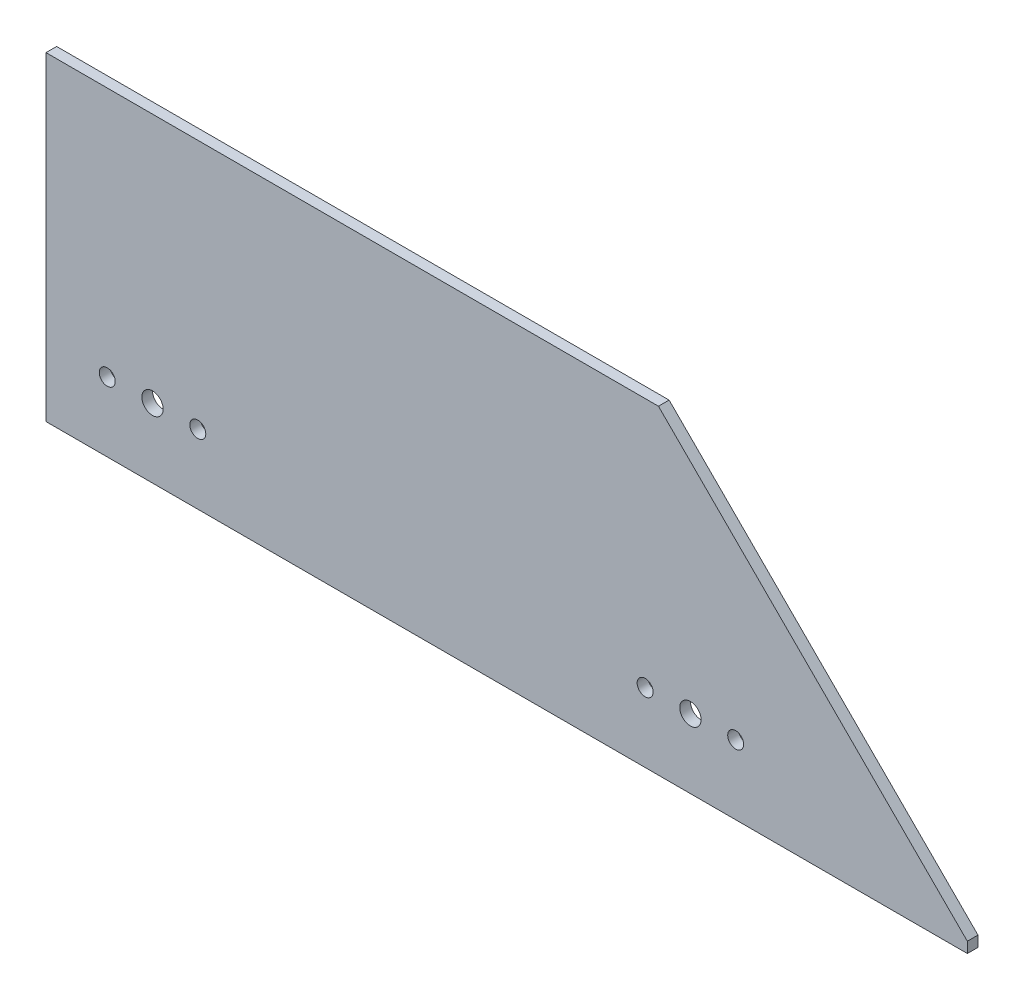
ISO-10303-21;
HEADER;
FILE_DESCRIPTION(('STEP AP214'),'2;1');
FILE_NAME('part.step','',(''),(''),'','','');
FILE_SCHEMA(('AUTOMOTIVE_DESIGN { 1 0 10303 214 1 1 1 1 }'));
ENDSEC;
DATA;
#1=APPLICATION_CONTEXT('core data for automotive mechanical design processes');
#2=APPLICATION_PROTOCOL_DEFINITION('international standard','automotive_design',2000,#1);
#3=PRODUCT_CONTEXT('',#1,'mechanical');
#4=PRODUCT('Part','Part','',(#3));
#5=PRODUCT_RELATED_PRODUCT_CATEGORY('part','',(#4));
#6=PRODUCT_DEFINITION_FORMATION('','',#4);
#7=PRODUCT_DEFINITION_CONTEXT('part definition',#1,'design');
#8=PRODUCT_DEFINITION('design','',#6,#7);
#9=PRODUCT_DEFINITION_SHAPE('','',#8);
#10=(LENGTH_UNIT() NAMED_UNIT(*) SI_UNIT(.MILLI.,.METRE.));
#11=(NAMED_UNIT(*) PLANE_ANGLE_UNIT() SI_UNIT($,.RADIAN.));
#12=(NAMED_UNIT(*) SI_UNIT($,.STERADIAN.) SOLID_ANGLE_UNIT());
#13=UNCERTAINTY_MEASURE_WITH_UNIT(LENGTH_MEASURE(1.E-05),#10,'distance_accuracy_value','');
#14=(GEOMETRIC_REPRESENTATION_CONTEXT(3) GLOBAL_UNCERTAINTY_ASSIGNED_CONTEXT((#13)) GLOBAL_UNIT_ASSIGNED_CONTEXT((#10,
#11,#12)) REPRESENTATION_CONTEXT('',''));
#15=CARTESIAN_POINT('',(0.,0.,0.));
#16=DIRECTION('',(0.,0.,1.));
#17=DIRECTION('',(1.,0.,0.));
#18=AXIS2_PLACEMENT_3D('',#15,#16,#17);
#19=CARTESIAN_POINT('',(173.,0.,2.));
#20=DIRECTION('',(0.,1.,0.));
#21=DIRECTION('',(-1.,0.,0.));
#22=AXIS2_PLACEMENT_3D('',#19,#20,#21);
#23=PLANE('',#22);
#24=DIRECTION('',(1.,0.,0.));
#25=VECTOR('',#24,1.);
#26=CARTESIAN_POINT('',(173.,0.,0.));
#27=LINE('',#26,#25);
#28=CARTESIAN_POINT('',(0.,0.,0.));
#29=VERTEX_POINT('',#28);
#30=CARTESIAN_POINT('',(173.,0.,0.));
#31=VERTEX_POINT('',#30);
#32=EDGE_CURVE('E119',#29,#31,#27,.T.);
#33=ORIENTED_EDGE('',*,*,#32,.T.);
#34=DIRECTION('',(0.,0.,-1.));
#35=VECTOR('',#34,1.);
#36=CARTESIAN_POINT('',(173.,0.,2.));
#37=LINE('',#36,#35);
#38=CARTESIAN_POINT('',(173.,0.,2.));
#39=VERTEX_POINT('',#38);
#40=EDGE_CURVE('E11',#39,#31,#37,.T.);
#41=ORIENTED_EDGE('',*,*,#40,.F.);
#42=DIRECTION('',(1.,0.,0.));
#43=VECTOR('',#42,1.);
#44=CARTESIAN_POINT('',(173.,0.,2.));
#45=LINE('',#44,#43);
#46=CARTESIAN_POINT('',(0.,0.,2.));
#47=VERTEX_POINT('',#46);
#48=EDGE_CURVE('E134',#47,#39,#45,.T.);
#49=ORIENTED_EDGE('',*,*,#48,.F.);
#50=DIRECTION('',(0.,0.,-1.));
#51=VECTOR('',#50,1.);
#52=CARTESIAN_POINT('',(0.,0.,2.));
#53=LINE('',#52,#51);
#54=EDGE_CURVE('E115',#47,#29,#53,.T.);
#55=ORIENTED_EDGE('',*,*,#54,.T.);
#56=EDGE_LOOP('',(#33,#41,#49,#55));
#57=FACE_BOUND('',#56,.T.);
#58=ADVANCED_FACE('F39',(#57),#23,.F.);
#59=CARTESIAN_POINT('',(173.,2.00000000000001,2.));
#60=DIRECTION('',(-1.,0.,0.));
#61=DIRECTION('',(0.,0.,1.));
#62=AXIS2_PLACEMENT_3D('',#59,#60,#61);
#63=PLANE('',#62);
#64=DIRECTION('',(0.,1.,0.));
#65=VECTOR('',#64,1.);
#66=CARTESIAN_POINT('',(173.,2.00000000000001,0.));
#67=LINE('',#66,#65);
#68=CARTESIAN_POINT('',(173.,2.00000000000001,0.));
#69=VERTEX_POINT('',#68);
#70=EDGE_CURVE('E123',#31,#69,#67,.T.);
#71=ORIENTED_EDGE('',*,*,#70,.T.);
#72=DIRECTION('',(0.,0.,-1.));
#73=VECTOR('',#72,1.);
#74=CARTESIAN_POINT('',(173.,2.00000000000001,2.));
#75=LINE('',#74,#73);
#76=CARTESIAN_POINT('',(173.,2.00000000000001,2.));
#77=VERTEX_POINT('',#76);
#78=EDGE_CURVE('E48',#77,#69,#75,.T.);
#79=ORIENTED_EDGE('',*,*,#78,.F.);
#80=DIRECTION('',(0.,1.,0.));
#81=VECTOR('',#80,1.);
#82=CARTESIAN_POINT('',(173.,2.00000000000001,2.));
#83=LINE('',#82,#81);
#84=EDGE_CURVE('E87',#39,#77,#83,.T.);
#85=ORIENTED_EDGE('',*,*,#84,.F.);
#86=ORIENTED_EDGE('',*,*,#40,.T.);
#87=EDGE_LOOP('',(#71,#79,#85,#86));
#88=FACE_BOUND('',#87,.T.);
#89=ADVANCED_FACE('F229',(#88),#63,.F.);
#90=CARTESIAN_POINT('',(114.999999999999,60.,2.));
#91=DIRECTION('',(-0.707106781186543,-0.707106781186552,0.));
#92=DIRECTION('',(0.707106781186552,-0.707106781186543,0.));
#93=AXIS2_PLACEMENT_3D('',#90,#91,#92);
#94=PLANE('',#93);
#95=DIRECTION('',(-0.707106781186552,0.707106781186543,0.));
#96=VECTOR('',#95,1.);
#97=CARTESIAN_POINT('',(114.999999999999,60.,0.));
#98=LINE('',#97,#96);
#99=CARTESIAN_POINT('',(114.999999999999,60.,0.));
#100=VERTEX_POINT('',#99);
#101=EDGE_CURVE('E106',#69,#100,#98,.T.);
#102=ORIENTED_EDGE('',*,*,#101,.T.);
#103=DIRECTION('',(0.,0.,-1.));
#104=VECTOR('',#103,1.);
#105=CARTESIAN_POINT('',(114.999999999999,60.,2.));
#106=LINE('',#105,#104);
#107=CARTESIAN_POINT('',(114.999999999999,60.,2.));
#108=VERTEX_POINT('',#107);
#109=EDGE_CURVE('E103',#108,#100,#106,.T.);
#110=ORIENTED_EDGE('',*,*,#109,.F.);
#111=DIRECTION('',(-0.707106781186552,0.707106781186543,0.));
#112=VECTOR('',#111,1.);
#113=CARTESIAN_POINT('',(114.999999999999,60.,2.));
#114=LINE('',#113,#112);
#115=EDGE_CURVE('E91',#77,#108,#114,.T.);
#116=ORIENTED_EDGE('',*,*,#115,.F.);
#117=ORIENTED_EDGE('',*,*,#78,.T.);
#118=EDGE_LOOP('',(#102,#110,#116,#117));
#119=FACE_BOUND('',#118,.T.);
#120=ADVANCED_FACE('F104',(#119),#94,.F.);
#121=CARTESIAN_POINT('',(0.,60.,2.));
#122=DIRECTION('',(0.,-1.,0.));
#123=DIRECTION('',(0.,0.,-1.));
#124=AXIS2_PLACEMENT_3D('',#121,#122,#123);
#125=PLANE('',#124);
#126=DIRECTION('',(-1.,0.,0.));
#127=VECTOR('',#126,1.);
#128=CARTESIAN_POINT('',(0.,60.,0.));
#129=LINE('',#128,#127);
#130=CARTESIAN_POINT('',(0.,60.,0.));
#131=VERTEX_POINT('',#130);
#132=EDGE_CURVE('E129',#100,#131,#129,.T.);
#133=ORIENTED_EDGE('',*,*,#132,.T.);
#134=DIRECTION('',(0.,0.,-1.));
#135=VECTOR('',#134,1.);
#136=CARTESIAN_POINT('',(0.,60.,2.));
#137=LINE('',#136,#135);
#138=CARTESIAN_POINT('',(0.,60.,2.));
#139=VERTEX_POINT('',#138);
#140=EDGE_CURVE('E109',#139,#131,#137,.T.);
#141=ORIENTED_EDGE('',*,*,#140,.F.);
#142=DIRECTION('',(-1.,0.,0.));
#143=VECTOR('',#142,1.);
#144=CARTESIAN_POINT('',(43.0000000000004,60.,2.));
#145=LINE('',#144,#143);
#146=EDGE_CURVE('E95',#108,#139,#145,.T.);
#147=ORIENTED_EDGE('',*,*,#146,.F.);
#148=ORIENTED_EDGE('',*,*,#109,.T.);
#149=EDGE_LOOP('',(#133,#141,#147,#148));
#150=FACE_BOUND('',#149,.T.);
#151=ADVANCED_FACE('F111',(#150),#125,.F.);
#152=CARTESIAN_POINT('',(0.,0.,2.));
#153=DIRECTION('',(1.,0.,0.));
#154=DIRECTION('',(0.,0.,-1.));
#155=AXIS2_PLACEMENT_3D('',#152,#153,#154);
#156=PLANE('',#155);
#157=DIRECTION('',(0.,-1.,0.));
#158=VECTOR('',#157,1.);
#159=CARTESIAN_POINT('',(0.,0.,0.));
#160=LINE('',#159,#158);
#161=EDGE_CURVE('E75',#131,#29,#160,.T.);
#162=ORIENTED_EDGE('',*,*,#161,.T.);
#163=ORIENTED_EDGE('',*,*,#54,.F.);
#164=DIRECTION('',(0.,-1.,0.));
#165=VECTOR('',#164,1.);
#166=CARTESIAN_POINT('',(0.,2.,2.));
#167=LINE('',#166,#165);
#168=EDGE_CURVE('E56',#139,#47,#167,.T.);
#169=ORIENTED_EDGE('',*,*,#168,.F.);
#170=ORIENTED_EDGE('',*,*,#140,.T.);
#171=EDGE_LOOP('',(#162,#163,#169,#170));
#172=FACE_BOUND('',#171,.T.);
#173=ADVANCED_FACE('F140',(#172),#156,.F.);
#174=CARTESIAN_POINT('',(0.,0.,2.));
#175=DIRECTION('',(0.,0.,-1.));
#176=DIRECTION('',(-1.,0.,0.));
#177=AXIS2_PLACEMENT_3D('',#174,#175,#176);
#178=PLANE('',#177);
#179=CARTESIAN_POINT('',(11.5,13.,2.));
#180=DIRECTION('',(0.,0.,1.));
#181=DIRECTION('',(1.,0.,0.));
#182=AXIS2_PLACEMENT_3D('',#179,#180,#181);
#183=CIRCLE('',#182,1.5);
#184=CARTESIAN_POINT('',(13.,13.,2.));
#185=VERTEX_POINT('',#184);
#186=EDGE_CURVE('E156',#185,#185,#183,.T.);
#187=ORIENTED_EDGE('',*,*,#186,.F.);
#188=EDGE_LOOP('',(#187));
#189=FACE_BOUND('',#188,.T.);
#190=CARTESIAN_POINT('',(121.,13.,2.));
#191=DIRECTION('',(0.,0.,1.));
#192=DIRECTION('',(1.,0.,0.));
#193=AXIS2_PLACEMENT_3D('',#190,#191,#192);
#194=CIRCLE('',#193,2.);
#195=CARTESIAN_POINT('',(123.,13.,2.));
#196=VERTEX_POINT('',#195);
#197=EDGE_CURVE('E174',#196,#196,#194,.T.);
#198=ORIENTED_EDGE('',*,*,#197,.F.);
#199=EDGE_LOOP('',(#198));
#200=FACE_BOUND('',#199,.T.);
#201=CARTESIAN_POINT('',(28.5,13.,2.));
#202=DIRECTION('',(0.,0.,1.));
#203=DIRECTION('',(1.,0.,0.));
#204=AXIS2_PLACEMENT_3D('',#201,#202,#203);
#205=CIRCLE('',#204,1.5);
#206=CARTESIAN_POINT('',(30.,13.,2.));
#207=VERTEX_POINT('',#206);
#208=EDGE_CURVE('E165',#207,#207,#205,.T.);
#209=ORIENTED_EDGE('',*,*,#208,.F.);
#210=EDGE_LOOP('',(#209));
#211=FACE_BOUND('',#210,.T.);
#212=CARTESIAN_POINT('',(112.5,13.,2.));
#213=DIRECTION('',(0.,0.,1.));
#214=DIRECTION('',(1.,0.,0.));
#215=AXIS2_PLACEMENT_3D('',#212,#213,#214);
#216=CIRCLE('',#215,1.5);
#217=CARTESIAN_POINT('',(114.,13.,2.));
#218=VERTEX_POINT('',#217);
#219=EDGE_CURVE('E188',#218,#218,#216,.T.);
#220=ORIENTED_EDGE('',*,*,#219,.F.);
#221=EDGE_LOOP('',(#220));
#222=FACE_BOUND('',#221,.T.);
#223=CARTESIAN_POINT('',(129.5,13.,2.));
#224=DIRECTION('',(0.,0.,1.));
#225=DIRECTION('',(1.,0.,0.));
#226=AXIS2_PLACEMENT_3D('',#223,#224,#225);
#227=CIRCLE('',#226,1.5);
#228=CARTESIAN_POINT('',(131.,13.,2.));
#229=VERTEX_POINT('',#228);
#230=EDGE_CURVE('E164',#229,#229,#227,.T.);
#231=ORIENTED_EDGE('',*,*,#230,.F.);
#232=EDGE_LOOP('',(#231));
#233=FACE_BOUND('',#232,.T.);
#234=CARTESIAN_POINT('',(20.,13.,2.));
#235=DIRECTION('',(0.,0.,1.));
#236=DIRECTION('',(1.,0.,0.));
#237=AXIS2_PLACEMENT_3D('',#234,#235,#236);
#238=CIRCLE('',#237,2.);
#239=CARTESIAN_POINT('',(22.,13.,2.));
#240=VERTEX_POINT('',#239);
#241=EDGE_CURVE('E148',#240,#240,#238,.T.);
#242=ORIENTED_EDGE('',*,*,#241,.F.);
#243=EDGE_LOOP('',(#242));
#244=FACE_BOUND('',#243,.T.);
#245=ORIENTED_EDGE('',*,*,#48,.T.);
#246=ORIENTED_EDGE('',*,*,#84,.T.);
#247=ORIENTED_EDGE('',*,*,#115,.T.);
#248=ORIENTED_EDGE('',*,*,#146,.T.);
#249=ORIENTED_EDGE('',*,*,#168,.T.);
#250=EDGE_LOOP('',(#245,#246,#247,#248,#249));
#251=FACE_BOUND('',#250,.T.);
#252=ADVANCED_FACE('F93',(#189,#200,#211,#222,#233,#244,#251),#178,.F.);
#253=CARTESIAN_POINT('',(0.,0.,0.));
#254=DIRECTION('',(0.,0.,-1.));
#255=DIRECTION('',(-1.,0.,0.));
#256=AXIS2_PLACEMENT_3D('',#253,#254,#255);
#257=PLANE('',#256);
#258=CARTESIAN_POINT('',(11.5,13.,0.));
#259=DIRECTION('',(0.,0.,1.));
#260=DIRECTION('',(1.,0.,0.));
#261=AXIS2_PLACEMENT_3D('',#258,#259,#260);
#262=CIRCLE('',#261,1.5);
#263=CARTESIAN_POINT('',(13.,13.,0.));
#264=VERTEX_POINT('',#263);
#265=EDGE_CURVE('E160',#264,#264,#262,.T.);
#266=ORIENTED_EDGE('',*,*,#265,.T.);
#267=EDGE_LOOP('',(#266));
#268=FACE_BOUND('',#267,.T.);
#269=CARTESIAN_POINT('',(121.,13.,0.));
#270=DIRECTION('',(0.,0.,1.));
#271=DIRECTION('',(1.,0.,0.));
#272=AXIS2_PLACEMENT_3D('',#269,#270,#271);
#273=CIRCLE('',#272,2.);
#274=CARTESIAN_POINT('',(123.,13.,0.));
#275=VERTEX_POINT('',#274);
#276=EDGE_CURVE('E152',#275,#275,#273,.T.);
#277=ORIENTED_EDGE('',*,*,#276,.T.);
#278=EDGE_LOOP('',(#277));
#279=FACE_BOUND('',#278,.T.);
#280=CARTESIAN_POINT('',(28.5,13.,0.));
#281=DIRECTION('',(0.,0.,1.));
#282=DIRECTION('',(1.,0.,0.));
#283=AXIS2_PLACEMENT_3D('',#280,#281,#282);
#284=CIRCLE('',#283,1.5);
#285=CARTESIAN_POINT('',(30.,13.,0.));
#286=VERTEX_POINT('',#285);
#287=EDGE_CURVE('E169',#286,#286,#284,.T.);
#288=ORIENTED_EDGE('',*,*,#287,.T.);
#289=EDGE_LOOP('',(#288));
#290=FACE_BOUND('',#289,.T.);
#291=CARTESIAN_POINT('',(112.5,13.,0.));
#292=DIRECTION('',(0.,0.,1.));
#293=DIRECTION('',(1.,0.,0.));
#294=AXIS2_PLACEMENT_3D('',#291,#292,#293);
#295=CIRCLE('',#294,1.5);
#296=CARTESIAN_POINT('',(114.,13.,0.));
#297=VERTEX_POINT('',#296);
#298=EDGE_CURVE('E170',#297,#297,#295,.T.);
#299=ORIENTED_EDGE('',*,*,#298,.T.);
#300=EDGE_LOOP('',(#299));
#301=FACE_BOUND('',#300,.T.);
#302=CARTESIAN_POINT('',(129.5,13.,0.));
#303=DIRECTION('',(0.,0.,1.));
#304=DIRECTION('',(1.,0.,0.));
#305=AXIS2_PLACEMENT_3D('',#302,#303,#304);
#306=CIRCLE('',#305,1.5);
#307=CARTESIAN_POINT('',(131.,13.,0.));
#308=VERTEX_POINT('',#307);
#309=EDGE_CURVE('E184',#308,#308,#306,.T.);
#310=ORIENTED_EDGE('',*,*,#309,.T.);
#311=EDGE_LOOP('',(#310));
#312=FACE_BOUND('',#311,.T.);
#313=CARTESIAN_POINT('',(20.,13.,0.));
#314=DIRECTION('',(0.,0.,1.));
#315=DIRECTION('',(1.,0.,0.));
#316=AXIS2_PLACEMENT_3D('',#313,#314,#315);
#317=CIRCLE('',#316,2.);
#318=CARTESIAN_POINT('',(22.,13.,0.));
#319=VERTEX_POINT('',#318);
#320=EDGE_CURVE('E124',#319,#319,#317,.T.);
#321=ORIENTED_EDGE('',*,*,#320,.T.);
#322=EDGE_LOOP('',(#321));
#323=FACE_BOUND('',#322,.T.);
#324=ORIENTED_EDGE('',*,*,#32,.F.);
#325=ORIENTED_EDGE('',*,*,#161,.F.);
#326=ORIENTED_EDGE('',*,*,#132,.F.);
#327=ORIENTED_EDGE('',*,*,#101,.F.);
#328=ORIENTED_EDGE('',*,*,#70,.F.);
#329=EDGE_LOOP('',(#324,#325,#326,#327,#328));
#330=FACE_BOUND('',#329,.T.);
#331=ADVANCED_FACE('F139',(#268,#279,#290,#301,#312,#323,#330),#257,.T.);
#332=CARTESIAN_POINT('',(20.,13.,0.));
#333=DIRECTION('',(0.,0.,1.));
#334=DIRECTION('',(1.,0.,0.));
#335=AXIS2_PLACEMENT_3D('',#332,#333,#334);
#336=CYLINDRICAL_SURFACE('',#335,2.);
#337=ORIENTED_EDGE('',*,*,#320,.F.);
#338=EDGE_LOOP('',(#337));
#339=FACE_BOUND('',#338,.T.);
#340=ORIENTED_EDGE('',*,*,#241,.T.);
#341=EDGE_LOOP('',(#340));
#342=FACE_BOUND('',#341,.T.);
#343=ADVANCED_FACE('F214',(#339,#342),#336,.F.);
#344=CARTESIAN_POINT('',(129.5,13.,0.));
#345=DIRECTION('',(0.,0.,1.));
#346=DIRECTION('',(1.,0.,0.));
#347=AXIS2_PLACEMENT_3D('',#344,#345,#346);
#348=CYLINDRICAL_SURFACE('',#347,1.5);
#349=ORIENTED_EDGE('',*,*,#309,.F.);
#350=EDGE_LOOP('',(#349));
#351=FACE_BOUND('',#350,.T.);
#352=ORIENTED_EDGE('',*,*,#230,.T.);
#353=EDGE_LOOP('',(#352));
#354=FACE_BOUND('',#353,.T.);
#355=ADVANCED_FACE('F202',(#351,#354),#348,.F.);
#356=CARTESIAN_POINT('',(112.5,13.,0.));
#357=DIRECTION('',(0.,0.,1.));
#358=DIRECTION('',(1.,0.,0.));
#359=AXIS2_PLACEMENT_3D('',#356,#357,#358);
#360=CYLINDRICAL_SURFACE('',#359,1.5);
#361=ORIENTED_EDGE('',*,*,#298,.F.);
#362=EDGE_LOOP('',(#361));
#363=FACE_BOUND('',#362,.T.);
#364=ORIENTED_EDGE('',*,*,#219,.T.);
#365=EDGE_LOOP('',(#364));
#366=FACE_BOUND('',#365,.T.);
#367=ADVANCED_FACE('F198',(#363,#366),#360,.F.);
#368=CARTESIAN_POINT('',(28.5,13.,0.));
#369=DIRECTION('',(0.,0.,1.));
#370=DIRECTION('',(1.,0.,0.));
#371=AXIS2_PLACEMENT_3D('',#368,#369,#370);
#372=CYLINDRICAL_SURFACE('',#371,1.5);
#373=ORIENTED_EDGE('',*,*,#287,.F.);
#374=EDGE_LOOP('',(#373));
#375=FACE_BOUND('',#374,.T.);
#376=ORIENTED_EDGE('',*,*,#208,.T.);
#377=EDGE_LOOP('',(#376));
#378=FACE_BOUND('',#377,.T.);
#379=ADVANCED_FACE('F201',(#375,#378),#372,.F.);
#380=CARTESIAN_POINT('',(121.,13.,0.));
#381=DIRECTION('',(0.,0.,1.));
#382=DIRECTION('',(1.,0.,0.));
#383=AXIS2_PLACEMENT_3D('',#380,#381,#382);
#384=CYLINDRICAL_SURFACE('',#383,2.);
#385=ORIENTED_EDGE('',*,*,#276,.F.);
#386=EDGE_LOOP('',(#385));
#387=FACE_BOUND('',#386,.T.);
#388=ORIENTED_EDGE('',*,*,#197,.T.);
#389=EDGE_LOOP('',(#388));
#390=FACE_BOUND('',#389,.T.);
#391=ADVANCED_FACE('F278',(#387,#390),#384,.F.);
#392=CARTESIAN_POINT('',(11.5,13.,0.));
#393=DIRECTION('',(0.,0.,1.));
#394=DIRECTION('',(1.,0.,0.));
#395=AXIS2_PLACEMENT_3D('',#392,#393,#394);
#396=CYLINDRICAL_SURFACE('',#395,1.5);
#397=ORIENTED_EDGE('',*,*,#265,.F.);
#398=EDGE_LOOP('',(#397));
#399=FACE_BOUND('',#398,.T.);
#400=ORIENTED_EDGE('',*,*,#186,.T.);
#401=EDGE_LOOP('',(#400));
#402=FACE_BOUND('',#401,.T.);
#403=ADVANCED_FACE('F288',(#399,#402),#396,.F.);
#404=CLOSED_SHELL('',(#58,#89,#120,#151,#173,#252,#331,#343,#355,#367,#379,#391,#403));
#405=MANIFOLD_SOLID_BREP('B2',#404);
#406=ADVANCED_BREP_SHAPE_REPRESENTATION('',(#18,#405),#14);
#407=SHAPE_DEFINITION_REPRESENTATION(#9,#406);
ENDSEC;
END-ISO-10303-21;
